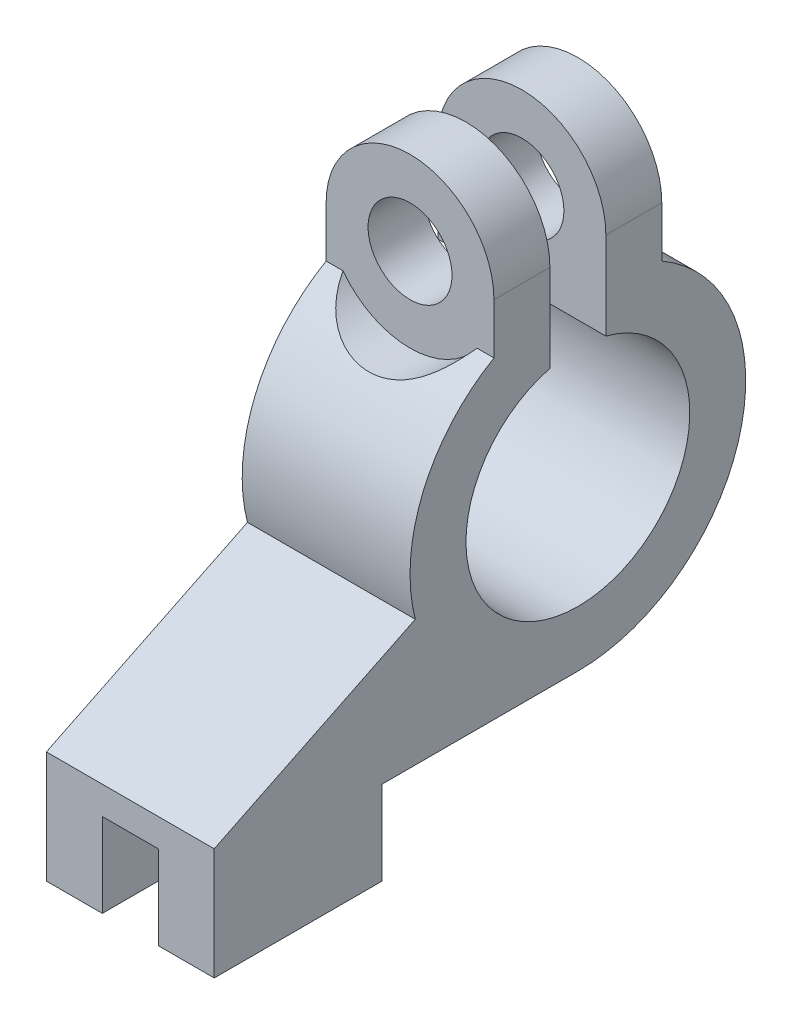
ISO-10303-21;
HEADER;
FILE_DESCRIPTION(('STEP AP214'),'2;1');
FILE_NAME('part.step','',(''),(''),'','','');
FILE_SCHEMA(('AUTOMOTIVE_DESIGN { 1 0 10303 214 1 1 1 1 }'));
ENDSEC;
DATA;
#1=APPLICATION_CONTEXT('core data for automotive mechanical design processes');
#2=APPLICATION_PROTOCOL_DEFINITION('international standard','automotive_design',2000,#1);
#3=PRODUCT_CONTEXT('',#1,'mechanical');
#4=PRODUCT('Part','Part','',(#3));
#5=PRODUCT_RELATED_PRODUCT_CATEGORY('part','',(#4));
#6=PRODUCT_DEFINITION_FORMATION('','',#4);
#7=PRODUCT_DEFINITION_CONTEXT('part definition',#1,'design');
#8=PRODUCT_DEFINITION('design','',#6,#7);
#9=PRODUCT_DEFINITION_SHAPE('','',#8);
#10=(LENGTH_UNIT() NAMED_UNIT(*) SI_UNIT(.MILLI.,.METRE.));
#11=(NAMED_UNIT(*) PLANE_ANGLE_UNIT() SI_UNIT($,.RADIAN.));
#12=(NAMED_UNIT(*) SI_UNIT($,.STERADIAN.) SOLID_ANGLE_UNIT());
#13=UNCERTAINTY_MEASURE_WITH_UNIT(LENGTH_MEASURE(1.E-05),#10,'distance_accuracy_value','');
#14=(GEOMETRIC_REPRESENTATION_CONTEXT(3) GLOBAL_UNCERTAINTY_ASSIGNED_CONTEXT((#13)) GLOBAL_UNIT_ASSIGNED_CONTEXT((#10,
#11,#12)) REPRESENTATION_CONTEXT('',''));
#15=CARTESIAN_POINT('',(0.,0.,0.));
#16=DIRECTION('',(0.,0.,1.));
#17=DIRECTION('',(1.,0.,0.));
#18=AXIS2_PLACEMENT_3D('',#15,#16,#17);
#19=CARTESIAN_POINT('',(30.,-45.,0.));
#20=DIRECTION('',(0.,1.,0.));
#21=DIRECTION('',(0.,0.,1.));
#22=AXIS2_PLACEMENT_3D('',#19,#20,#21);
#23=PLANE('',#22);
#24=DIRECTION('',(0.,0.,-1.));
#25=VECTOR('',#24,1.);
#26=CARTESIAN_POINT('',(10.,-45.,0.));
#27=LINE('',#26,#25);
#28=CARTESIAN_POINT('',(10.,-45.,65.));
#29=VERTEX_POINT('',#28);
#30=CARTESIAN_POINT('',(10.,-45.,35.));
#31=VERTEX_POINT('',#30);
#32=EDGE_CURVE('E72',#29,#31,#27,.T.);
#33=ORIENTED_EDGE('',*,*,#32,.F.);
#34=DIRECTION('',(-1.,0.,0.));
#35=VECTOR('',#34,1.);
#36=CARTESIAN_POINT('',(30.,-45.,65.));
#37=LINE('',#36,#35);
#38=CARTESIAN_POINT('',(0.,-45.,65.));
#39=VERTEX_POINT('',#38);
#40=EDGE_CURVE('E217',#29,#39,#37,.T.);
#41=ORIENTED_EDGE('',*,*,#40,.T.);
#42=DIRECTION('',(0.,0.,-1.));
#43=VECTOR('',#42,1.);
#44=CARTESIAN_POINT('',(0.,-45.,0.));
#45=LINE('',#44,#43);
#46=CARTESIAN_POINT('',(0.,-45.,35.));
#47=VERTEX_POINT('',#46);
#48=EDGE_CURVE('E322',#39,#47,#45,.T.);
#49=ORIENTED_EDGE('',*,*,#48,.T.);
#50=DIRECTION('',(-1.,0.,0.));
#51=VECTOR('',#50,1.);
#52=CARTESIAN_POINT('',(30.,-45.,35.));
#53=LINE('',#52,#51);
#54=EDGE_CURVE('E218',#31,#47,#53,.T.);
#55=ORIENTED_EDGE('',*,*,#54,.F.);
#56=EDGE_LOOP('',(#33,#41,#49,#55));
#57=FACE_BOUND('',#56,.T.);
#58=ADVANCED_FACE('F53',(#57),#23,.F.);
#59=CARTESIAN_POINT('',(30.,0.,35.));
#60=DIRECTION('',(0.,0.,1.));
#61=DIRECTION('',(1.,0.,0.));
#62=AXIS2_PLACEMENT_3D('',#59,#60,#61);
#63=PLANE('',#62);
#64=DIRECTION('',(0.,1.,0.));
#65=VECTOR('',#64,1.);
#66=CARTESIAN_POINT('',(10.,0.,35.));
#67=LINE('',#66,#65);
#68=CARTESIAN_POINT('',(10.,-30.,35.));
#69=VERTEX_POINT('',#68);
#70=EDGE_CURVE('E313',#31,#69,#67,.T.);
#71=ORIENTED_EDGE('',*,*,#70,.F.);
#72=ORIENTED_EDGE('',*,*,#54,.T.);
#73=DIRECTION('',(0.,1.,0.));
#74=VECTOR('',#73,1.);
#75=CARTESIAN_POINT('',(0.,0.,35.));
#76=LINE('',#75,#74);
#77=CARTESIAN_POINT('',(0.,-30.,35.));
#78=VERTEX_POINT('',#77);
#79=EDGE_CURVE('E325',#47,#78,#76,.T.);
#80=ORIENTED_EDGE('',*,*,#79,.T.);
#81=DIRECTION('',(-1.,0.,0.));
#82=VECTOR('',#81,1.);
#83=CARTESIAN_POINT('',(30.,-30.,35.));
#84=LINE('',#83,#82);
#85=EDGE_CURVE('E368',#69,#78,#84,.T.);
#86=ORIENTED_EDGE('',*,*,#85,.F.);
#87=EDGE_LOOP('',(#71,#72,#80,#86));
#88=FACE_BOUND('',#87,.T.);
#89=ADVANCED_FACE('F286',(#88),#63,.F.);
#90=CARTESIAN_POINT('',(30.,0.,0.));
#91=DIRECTION('',(-1.,0.,0.));
#92=DIRECTION('',(0.,0.,1.));
#93=AXIS2_PLACEMENT_3D('',#90,#91,#92);
#94=CYLINDRICAL_SURFACE('',#93,30.);
#95=CARTESIAN_POINT('',(3.01445253868973,25.9807621135332,15.));
#96=CARTESIAN_POINT('',(3.08971257503611,25.8807547670215,15.1732226364169));
#97=CARTESIAN_POINT('',(3.16782453931834,25.7795535388635,15.3445013375211));
#98=CARTESIAN_POINT('',(3.33005232698813,25.5750661159309,15.6829548925338));
#99=CARTESIAN_POINT('',(3.41416894225289,25.4717796474533,15.8501292012448));
#100=CARTESIAN_POINT('',(3.67614111428807,25.1590527444516,16.3454743989584));
#101=CARTESIAN_POINT('',(3.86345112948308,24.9469710486375,16.6670770668505));
#102=CARTESIAN_POINT('',(4.26626830385223,24.517916812582,17.292087734535));
#103=CARTESIAN_POINT('',(4.48192818952391,24.3009234674978,17.595383176681));
#104=CARTESIAN_POINT('',(4.94208136013862,23.8672507478766,18.1792865334444));
#105=CARTESIAN_POINT('',(5.18655853005551,23.65057126581,18.459906981627));
#106=CARTESIAN_POINT('',(5.66362743392203,23.2564095543692,18.9531675133448));
#107=CARTESIAN_POINT('',(5.89183030327061,23.0782172837144,19.1694900291297));
#108=CARTESIAN_POINT('',(6.36928801421941,22.7281456053987,19.5832791476924));
#109=CARTESIAN_POINT('',(6.61854308328254,22.556266265976,19.7807455466861));
#110=CARTESIAN_POINT('',(7.13697667140093,22.2223764688641,20.1551174725314));
#111=CARTESIAN_POINT('',(7.40610105682739,22.0603412402938,20.3320757186267));
#112=CARTESIAN_POINT('',(7.96388457149451,21.7487695138526,20.6650194826522));
#113=CARTESIAN_POINT('',(8.25254342282049,21.599232838234,20.8210052988606));
#114=CARTESIAN_POINT('',(8.84979349892589,21.3147875546876,21.1121183121129));
#115=CARTESIAN_POINT('',(9.15849946444014,21.1799776713007,21.2471070344364));
#116=CARTESIAN_POINT('',(9.79215978238597,20.9289472522521,21.4944236096393));
#117=CARTESIAN_POINT('',(10.1171146428044,20.8127272982423,21.6067507534995));
#118=CARTESIAN_POINT('',(10.7809878383971,20.6013415186415,21.8083952680617));
#119=CARTESIAN_POINT('',(11.1199149998221,20.5061892508699,21.8976978276535));
#120=CARTESIAN_POINT('',(11.8086639327969,20.3391369541052,22.0529486662081));
#121=CARTESIAN_POINT('',(12.1584846534091,20.2672346896796,22.1188991904715));
#122=CARTESIAN_POINT('',(12.8308417334297,20.1541513989451,22.2219579872299));
#123=CARTESIAN_POINT('',(13.1526503348693,20.1106335597506,22.2612753806805));
#124=CARTESIAN_POINT('',(13.8001496753213,20.0445248051273,22.3208203158092));
#125=CARTESIAN_POINT('',(14.1258401310602,20.0219323720493,22.3410492419117));
#126=CARTESIAN_POINT('',(14.7784653192773,19.9980834139667,22.3623995790454));
#127=CARTESIAN_POINT('',(15.1053993750215,19.996816592158,22.3635302114495));
#128=CARTESIAN_POINT('',(15.7581618927426,20.0156149512808,22.3467071172679));
#129=CARTESIAN_POINT('',(16.0839903635039,20.0356799623199,22.328753542674));
#130=CARTESIAN_POINT('',(16.7204105781226,20.0956831312075,22.2747631312453));
#131=CARTESIAN_POINT('',(17.0311295582828,20.1348824244758,22.2393982210993));
#132=CARTESIAN_POINT('',(17.6470410553454,20.2321170573487,22.1509763305753));
#133=CARTESIAN_POINT('',(17.9522337667894,20.2901517325233,22.0979199742723));
#134=CARTESIAN_POINT('',(18.5550191849141,20.4240896291477,21.9741862874433));
#135=CARTESIAN_POINT('',(18.8526120048402,20.499992584171,21.9035092196514));
#136=CARTESIAN_POINT('',(19.4382726601973,20.6684061513958,21.7446630852028));
#137=CARTESIAN_POINT('',(19.7263403349304,20.760917043619,21.6564937236107));
#138=CARTESIAN_POINT('',(20.295155898617,20.9624206557098,21.4615198509829));
#139=CARTESIAN_POINT('',(20.5757448446171,21.0716259932624,21.3544717241238));
#140=CARTESIAN_POINT('',(21.1237468076387,21.3037130119085,21.1229416175942));
#141=CARTESIAN_POINT('',(21.3911597902022,21.4265947287661,20.9984595923335));
#142=CARTESIAN_POINT('',(21.9114639103858,21.6839983852229,20.7325452046875));
#143=CARTESIAN_POINT('',(22.1643580263126,21.8185179232188,20.5911163371767));
#144=CARTESIAN_POINT('',(22.6547088909968,22.097094874822,20.2918746563285));
#145=CARTESIAN_POINT('',(22.892165244521,22.241152532431,20.1340614237916));
#146=CARTESIAN_POINT('',(23.3669139930002,22.5468919573389,19.7912601701808));
#147=CARTESIAN_POINT('',(23.6030521053302,22.7091030594606,19.6051464269669));
#148=CARTESIAN_POINT('',(24.0565563729563,23.0393355804947,19.2159865035483));
#149=CARTESIAN_POINT('',(24.2739210567547,23.2073574534237,19.01293899849));
#150=CARTESIAN_POINT('',(24.6901474035738,23.5469094417106,18.5907646384501));
#151=CARTESIAN_POINT('',(24.8889850057555,23.7184437756978,18.3716175175593));
#152=CARTESIAN_POINT('',(25.2681969172962,24.0624649530106,17.9186671474033));
#153=CARTESIAN_POINT('',(25.4485730293575,24.2349517015994,17.6848653327214));
#154=CARTESIAN_POINT('',(25.7548272549145,24.5419827655767,17.2552926786907));
#155=CARTESIAN_POINT('',(25.8841083002779,24.6767489251937,17.0620880356106));
#156=CARTESIAN_POINT('',(26.1320973424406,24.9446669949728,16.6679443106239));
#157=CARTESIAN_POINT('',(26.2508057639085,25.0778189697857,16.4670055398372));
#158=CARTESIAN_POINT('',(26.4776556886953,25.3411432547947,16.0588034359427));
#159=CARTESIAN_POINT('',(26.5858386399376,25.4713255667404,15.8515695102964));
#160=CARTESIAN_POINT('',(26.7926916753654,25.728559531358,15.4305622247241));
#161=CARTESIAN_POINT('',(26.8913632207323,25.8556116626616,15.2167898759258));
#162=CARTESIAN_POINT('',(26.9855474613103,25.9807621135332,15.));
#163=B_SPLINE_CURVE_WITH_KNOTS('',3,(#95,#96,#97,#98,#99,#100,#101,#102,#103,#104,#105,#106,
#107,#108,#109,#110,#111,#112,#113,#114,#115,#116,#117,#118,#119,#120,#121,#122,#123,#124,#125,
#126,#127,#128,#129,#130,#131,#132,#133,#134,#135,#136,#137,#138,#139,#140,#141,#142,#143,#144,
#145,#146,#147,#148,#149,#150,#151,#152,#153,#154,#155,#156,#157,#158,#159,#160,#161,#162),
.UNSPECIFIED.,.F.,.F.,(4,2,2,2,2,2,2,2,2,2,2,2,2,2,2,2,2,2,2,2,2,2,2,2,2,2,2,2,2,2,2,2,2,4),(0.,
0.641065834236214,1.28221636725091,2.5659585647395,3.85692398541223,5.14717087498479,
6.23035863765068,7.3135581053437,8.39390820328841,9.47424293444297,10.5614251489932,
11.6486413732381,12.7365552399378,13.8243644751847,14.8044723864152,15.7845092081503,
16.7640728178064,17.7436286260132,18.6880386662347,19.6324153954111,20.5767780442722,
21.5211566172647,22.4787567780406,23.4363594430163,24.3937649644797,25.3511949875249,
26.3750483533381,27.398981898065,28.4242271974174,29.4493722893141,30.2551753842046,
31.0609460979369,31.8634031512578,32.6657367306905),.UNSPECIFIED.);
#164=CARTESIAN_POINT('',(3.01445253868973,25.9807621135332,15.));
#165=VERTEX_POINT('',#164);
#166=CARTESIAN_POINT('',(26.9855474613103,25.9807621135332,15.));
#167=VERTEX_POINT('',#166);
#168=EDGE_CURVE('E65',#165,#167,#163,.T.);
#169=ORIENTED_EDGE('',*,*,#168,.F.);
#170=DIRECTION('',(-1.,0.,0.));
#171=VECTOR('',#170,1.);
#172=CARTESIAN_POINT('',(30.,25.9807621135332,15.));
#173=LINE('',#172,#171);
#174=CARTESIAN_POINT('',(0.,25.9807621135332,15.));
#175=VERTEX_POINT('',#174);
#176=EDGE_CURVE('E229',#165,#175,#173,.T.);
#177=ORIENTED_EDGE('',*,*,#176,.T.);
#178=CARTESIAN_POINT('',(0.,0.,0.));
#179=DIRECTION('',(1.,0.,0.));
#180=DIRECTION('',(0.,0.,-1.));
#181=AXIS2_PLACEMENT_3D('',#178,#179,#180);
#182=CIRCLE('',#181,30.);
#183=CARTESIAN_POINT('',(0.,-7.43900942873639,29.0630545318136));
#184=VERTEX_POINT('',#183);
#185=EDGE_CURVE('E327',#175,#184,#182,.T.);
#186=ORIENTED_EDGE('',*,*,#185,.T.);
#187=DIRECTION('',(-1.,0.,0.));
#188=VECTOR('',#187,1.);
#189=CARTESIAN_POINT('',(30.,-7.43900942873639,29.0630545318136));
#190=LINE('',#189,#188);
#191=CARTESIAN_POINT('',(30.,-7.43900942873639,29.0630545318136));
#192=VERTEX_POINT('',#191);
#193=EDGE_CURVE('E227',#192,#184,#190,.T.);
#194=ORIENTED_EDGE('',*,*,#193,.F.);
#195=CARTESIAN_POINT('',(30.,0.,0.));
#196=DIRECTION('',(1.,0.,0.));
#197=DIRECTION('',(0.,0.,-1.));
#198=AXIS2_PLACEMENT_3D('',#195,#196,#197);
#199=CIRCLE('',#198,30.);
#200=CARTESIAN_POINT('',(30.,25.9807621135332,15.));
#201=VERTEX_POINT('',#200);
#202=EDGE_CURVE('E358',#201,#192,#199,.T.);
#203=ORIENTED_EDGE('',*,*,#202,.F.);
#204=EDGE_CURVE('E230',#201,#167,#173,.T.);
#205=ORIENTED_EDGE('',*,*,#204,.T.);
#206=EDGE_LOOP('',(#169,#177,#186,#194,#203,#205));
#207=FACE_BOUND('',#206,.T.);
#208=ADVANCED_FACE('F253',(#207),#94,.T.);
#209=CARTESIAN_POINT('',(30.,0.,-15.));
#210=DIRECTION('',(0.,0.,1.));
#211=DIRECTION('',(1.,0.,0.));
#212=AXIS2_PLACEMENT_3D('',#209,#210,#211);
#213=PLANE('',#212);
#214=DIRECTION('',(-1.,0.,0.));
#215=VECTOR('',#214,1.);
#216=CARTESIAN_POINT('',(30.,25.9807621135332,-15.));
#217=LINE('',#216,#215);
#218=CARTESIAN_POINT('',(30.,25.9807621135332,-15.));
#219=VERTEX_POINT('',#218);
#220=CARTESIAN_POINT('',(26.9855474613103,25.9807621135332,-15.));
#221=VERTEX_POINT('',#220);
#222=EDGE_CURVE('E239',#219,#221,#217,.T.);
#223=ORIENTED_EDGE('',*,*,#222,.T.);
#224=CARTESIAN_POINT('',(15.,35.,-15.));
#225=DIRECTION('',(0.,0.,1.));
#226=DIRECTION('',(1.,0.,0.));
#227=AXIS2_PLACEMENT_3D('',#224,#225,#226);
#228=CIRCLE('',#227,15.);
#229=CARTESIAN_POINT('',(3.01445253868973,25.9807621135332,-15.));
#230=VERTEX_POINT('',#229);
#231=EDGE_CURVE('E80',#230,#221,#228,.T.);
#232=ORIENTED_EDGE('',*,*,#231,.F.);
#233=CARTESIAN_POINT('',(0.,25.9807621135332,-15.));
#234=VERTEX_POINT('',#233);
#235=EDGE_CURVE('E238',#230,#234,#217,.T.);
#236=ORIENTED_EDGE('',*,*,#235,.T.);
#237=DIRECTION('',(0.,1.,0.));
#238=VECTOR('',#237,1.);
#239=CARTESIAN_POINT('',(0.,0.,-15.));
#240=LINE('',#239,#238);
#241=CARTESIAN_POINT('',(0.,35.,-15.));
#242=VERTEX_POINT('',#241);
#243=EDGE_CURVE('E374',#234,#242,#240,.T.);
#244=ORIENTED_EDGE('',*,*,#243,.T.);
#245=CARTESIAN_POINT('',(15.,35.,-15.));
#246=DIRECTION('',(0.,0.,1.));
#247=DIRECTION('',(1.,0.,0.));
#248=AXIS2_PLACEMENT_3D('',#245,#246,#247);
#249=CIRCLE('',#248,15.);
#250=CARTESIAN_POINT('',(30.,35.,-15.));
#251=VERTEX_POINT('',#250);
#252=EDGE_CURVE('E429',#251,#242,#249,.T.);
#253=ORIENTED_EDGE('',*,*,#252,.F.);
#254=DIRECTION('',(0.,1.,0.));
#255=VECTOR('',#254,1.);
#256=CARTESIAN_POINT('',(30.,0.,-15.));
#257=LINE('',#256,#255);
#258=EDGE_CURVE('E340',#219,#251,#257,.T.);
#259=ORIENTED_EDGE('',*,*,#258,.F.);
#260=EDGE_LOOP('',(#223,#232,#236,#244,#253,#259));
#261=FACE_BOUND('',#260,.T.);
#262=CARTESIAN_POINT('',(15.,35.,-15.));
#263=DIRECTION('',(0.,0.,1.));
#264=DIRECTION('',(1.,0.,0.));
#265=AXIS2_PLACEMENT_3D('',#262,#263,#264);
#266=CIRCLE('',#265,7.5);
#267=CARTESIAN_POINT('',(22.5,35.,-15.));
#268=VERTEX_POINT('',#267);
#269=EDGE_CURVE('E414',#268,#268,#266,.T.);
#270=ORIENTED_EDGE('',*,*,#269,.T.);
#271=EDGE_LOOP('',(#270));
#272=FACE_BOUND('',#271,.T.);
#273=ADVANCED_FACE('F457',(#261,#272),#213,.F.);
#274=CARTESIAN_POINT('',(30.,0.,-5.));
#275=DIRECTION('',(0.,0.,-1.));
#276=DIRECTION('',(-1.,0.,0.));
#277=AXIS2_PLACEMENT_3D('',#274,#275,#276);
#278=PLANE('',#277);
#279=CARTESIAN_POINT('',(15.,35.,-5.));
#280=DIRECTION('',(0.,0.,-1.));
#281=DIRECTION('',(-1.,0.,0.));
#282=AXIS2_PLACEMENT_3D('',#279,#280,#281);
#283=CIRCLE('',#282,7.5);
#284=CARTESIAN_POINT('',(7.5,35.,-5.));
#285=VERTEX_POINT('',#284);
#286=EDGE_CURVE('E422',#285,#285,#283,.T.);
#287=ORIENTED_EDGE('',*,*,#286,.T.);
#288=EDGE_LOOP('',(#287));
#289=FACE_BOUND('',#288,.T.);
#290=DIRECTION('',(0.,-1.,0.));
#291=VECTOR('',#290,1.);
#292=CARTESIAN_POINT('',(30.,0.,-5.));
#293=LINE('',#292,#291);
#294=CARTESIAN_POINT('',(30.,35.,-5.));
#295=VERTEX_POINT('',#294);
#296=CARTESIAN_POINT('',(30.,19.3649167310371,-5.));
#297=VERTEX_POINT('',#296);
#298=EDGE_CURVE('E348',#295,#297,#293,.T.);
#299=ORIENTED_EDGE('',*,*,#298,.F.);
#300=CARTESIAN_POINT('',(15.,35.,-5.));
#301=DIRECTION('',(0.,0.,-1.));
#302=DIRECTION('',(-1.,0.,0.));
#303=AXIS2_PLACEMENT_3D('',#300,#301,#302);
#304=CIRCLE('',#303,15.);
#305=CARTESIAN_POINT('',(0.,35.,-5.));
#306=VERTEX_POINT('',#305);
#307=EDGE_CURVE('E343',#306,#295,#304,.T.);
#308=ORIENTED_EDGE('',*,*,#307,.F.);
#309=DIRECTION('',(0.,-1.,0.));
#310=VECTOR('',#309,1.);
#311=CARTESIAN_POINT('',(0.,0.,-5.));
#312=LINE('',#311,#310);
#313=CARTESIAN_POINT('',(0.,19.3649167310371,-5.));
#314=VERTEX_POINT('',#313);
#315=EDGE_CURVE('E377',#306,#314,#312,.T.);
#316=ORIENTED_EDGE('',*,*,#315,.T.);
#317=DIRECTION('',(-1.,0.,0.));
#318=VECTOR('',#317,1.);
#319=CARTESIAN_POINT('',(30.,19.3649167310371,-5.));
#320=LINE('',#319,#318);
#321=EDGE_CURVE('E235',#297,#314,#320,.T.);
#322=ORIENTED_EDGE('',*,*,#321,.F.);
#323=EDGE_LOOP('',(#299,#308,#316,#322));
#324=FACE_BOUND('',#323,.T.);
#325=ADVANCED_FACE('F446',(#289,#324),#278,.F.);
#326=CARTESIAN_POINT('',(30.,0.,5.));
#327=DIRECTION('',(0.,0.,1.));
#328=DIRECTION('',(1.,0.,0.));
#329=AXIS2_PLACEMENT_3D('',#326,#327,#328);
#330=PLANE('',#329);
#331=CARTESIAN_POINT('',(15.,35.,5.));
#332=DIRECTION('',(0.,0.,1.));
#333=DIRECTION('',(1.,0.,0.));
#334=AXIS2_PLACEMENT_3D('',#331,#332,#333);
#335=CIRCLE('',#334,7.5);
#336=CARTESIAN_POINT('',(22.5,35.,5.));
#337=VERTEX_POINT('',#336);
#338=EDGE_CURVE('E417',#337,#337,#335,.T.);
#339=ORIENTED_EDGE('',*,*,#338,.T.);
#340=EDGE_LOOP('',(#339));
#341=FACE_BOUND('',#340,.T.);
#342=CARTESIAN_POINT('',(15.,35.,5.));
#343=DIRECTION('',(0.,0.,1.));
#344=DIRECTION('',(1.,0.,0.));
#345=AXIS2_PLACEMENT_3D('',#342,#343,#344);
#346=CIRCLE('',#345,15.);
#347=CARTESIAN_POINT('',(30.,35.,5.));
#348=VERTEX_POINT('',#347);
#349=CARTESIAN_POINT('',(0.,35.,5.));
#350=VERTEX_POINT('',#349);
#351=EDGE_CURVE('E434',#348,#350,#346,.T.);
#352=ORIENTED_EDGE('',*,*,#351,.F.);
#353=DIRECTION('',(0.,1.,0.));
#354=VECTOR('',#353,1.);
#355=CARTESIAN_POINT('',(30.,0.,5.));
#356=LINE('',#355,#354);
#357=CARTESIAN_POINT('',(30.,19.3649167310371,5.));
#358=VERTEX_POINT('',#357);
#359=EDGE_CURVE('E353',#358,#348,#356,.T.);
#360=ORIENTED_EDGE('',*,*,#359,.F.);
#361=DIRECTION('',(-1.,0.,0.));
#362=VECTOR('',#361,1.);
#363=CARTESIAN_POINT('',(30.,19.3649167310371,5.));
#364=LINE('',#363,#362);
#365=CARTESIAN_POINT('',(0.,19.3649167310371,5.));
#366=VERTEX_POINT('',#365);
#367=EDGE_CURVE('E233',#358,#366,#364,.T.);
#368=ORIENTED_EDGE('',*,*,#367,.T.);
#369=DIRECTION('',(0.,1.,0.));
#370=VECTOR('',#369,1.);
#371=CARTESIAN_POINT('',(0.,0.,5.));
#372=LINE('',#371,#370);
#373=EDGE_CURVE('E382',#366,#350,#372,.T.);
#374=ORIENTED_EDGE('',*,*,#373,.T.);
#375=EDGE_LOOP('',(#352,#360,#368,#374));
#376=FACE_BOUND('',#375,.T.);
#377=ADVANCED_FACE('F451',(#341,#376),#330,.F.);
#378=CARTESIAN_POINT('',(30.,0.,15.));
#379=DIRECTION('',(0.,0.,-1.));
#380=DIRECTION('',(-1.,0.,0.));
#381=AXIS2_PLACEMENT_3D('',#378,#379,#380);
#382=PLANE('',#381);
#383=CARTESIAN_POINT('',(15.,35.,15.));
#384=DIRECTION('',(0.,0.,1.));
#385=DIRECTION('',(1.,0.,0.));
#386=AXIS2_PLACEMENT_3D('',#383,#384,#385);
#387=CIRCLE('',#386,7.5);
#388=CARTESIAN_POINT('',(22.5,35.,15.));
#389=VERTEX_POINT('',#388);
#390=EDGE_CURVE('E413',#389,#389,#387,.T.);
#391=ORIENTED_EDGE('',*,*,#390,.F.);
#392=EDGE_LOOP('',(#391));
#393=FACE_BOUND('',#392,.T.);
#394=CARTESIAN_POINT('',(15.,35.,15.));
#395=DIRECTION('',(0.,0.,1.));
#396=DIRECTION('',(1.,0.,0.));
#397=AXIS2_PLACEMENT_3D('',#394,#395,#396);
#398=CIRCLE('',#397,15.);
#399=CARTESIAN_POINT('',(30.,35.,15.));
#400=VERTEX_POINT('',#399);
#401=CARTESIAN_POINT('',(0.,35.,15.));
#402=VERTEX_POINT('',#401);
#403=EDGE_CURVE('E428',#400,#402,#398,.T.);
#404=ORIENTED_EDGE('',*,*,#403,.T.);
#405=DIRECTION('',(0.,-1.,0.));
#406=VECTOR('',#405,1.);
#407=CARTESIAN_POINT('',(0.,0.,15.));
#408=LINE('',#407,#406);
#409=EDGE_CURVE('E385',#402,#175,#408,.T.);
#410=ORIENTED_EDGE('',*,*,#409,.T.);
#411=ORIENTED_EDGE('',*,*,#176,.F.);
#412=CARTESIAN_POINT('',(15.,35.,15.));
#413=DIRECTION('',(0.,0.,1.));
#414=DIRECTION('',(1.,0.,0.));
#415=AXIS2_PLACEMENT_3D('',#412,#413,#414);
#416=CIRCLE('',#415,15.);
#417=EDGE_CURVE('E411',#165,#167,#416,.T.);
#418=ORIENTED_EDGE('',*,*,#417,.T.);
#419=ORIENTED_EDGE('',*,*,#204,.F.);
#420=DIRECTION('',(0.,-1.,0.));
#421=VECTOR('',#420,1.);
#422=CARTESIAN_POINT('',(30.,0.,15.));
#423=LINE('',#422,#421);
#424=EDGE_CURVE('E356',#400,#201,#423,.T.);
#425=ORIENTED_EDGE('',*,*,#424,.F.);
#426=EDGE_LOOP('',(#404,#410,#411,#418,#419,#425));
#427=FACE_BOUND('',#426,.T.);
#428=ADVANCED_FACE('F279',(#393,#427),#382,.F.);
#429=CARTESIAN_POINT('',(30.,0.,0.));
#430=DIRECTION('',(1.,0.,0.));
#431=DIRECTION('',(0.,0.,-1.));
#432=AXIS2_PLACEMENT_3D('',#429,#430,#431);
#433=PLANE('',#432);
#434=ORIENTED_EDGE('',*,*,#258,.T.);
#435=DIRECTION('',(0.,0.,1.));
#436=VECTOR('',#435,1.);
#437=CARTESIAN_POINT('',(30.,35.,-15.));
#438=LINE('',#437,#436);
#439=EDGE_CURVE('E425',#251,#295,#438,.T.);
#440=ORIENTED_EDGE('',*,*,#439,.T.);
#441=ORIENTED_EDGE('',*,*,#298,.T.);
#442=CARTESIAN_POINT('',(30.,0.,0.));
#443=DIRECTION('',(1.,0.,0.));
#444=DIRECTION('',(0.,0.,-1.));
#445=AXIS2_PLACEMENT_3D('',#442,#443,#444);
#446=CIRCLE('',#445,20.);
#447=EDGE_CURVE('E350',#358,#297,#446,.T.);
#448=ORIENTED_EDGE('',*,*,#447,.F.);
#449=ORIENTED_EDGE('',*,*,#359,.T.);
#450=DIRECTION('',(0.,0.,1.));
#451=VECTOR('',#450,1.);
#452=CARTESIAN_POINT('',(30.,35.,-15.));
#453=LINE('',#452,#451);
#454=EDGE_CURVE('E245',#348,#400,#453,.T.);
#455=ORIENTED_EDGE('',*,*,#454,.T.);
#456=ORIENTED_EDGE('',*,*,#424,.T.);
#457=ORIENTED_EDGE('',*,*,#202,.T.);
#458=DIRECTION('',(0.,0.439045010289997,-0.89846506829117));
#459=VECTOR('',#458,1.);
#460=CARTESIAN_POINT('',(30.,5.45934236146505,2.66776874010784));
#461=LINE('',#460,#459);
#462=CARTESIAN_POINT('',(30.,-25.,65.));
#463=VERTEX_POINT('',#462);
#464=EDGE_CURVE('E360',#463,#192,#461,.T.);
#465=ORIENTED_EDGE('',*,*,#464,.F.);
#466=DIRECTION('',(0.,1.,0.));
#467=VECTOR('',#466,1.);
#468=CARTESIAN_POINT('',(30.,0.,65.));
#469=LINE('',#468,#467);
#470=CARTESIAN_POINT('',(30.,-45.,65.));
#471=VERTEX_POINT('',#470);
#472=EDGE_CURVE('E363',#471,#463,#469,.T.);
#473=ORIENTED_EDGE('',*,*,#472,.F.);
#474=DIRECTION('',(0.,0.,-1.));
#475=VECTOR('',#474,1.);
#476=CARTESIAN_POINT('',(30.,-45.,0.));
#477=LINE('',#476,#475);
#478=CARTESIAN_POINT('',(30.,-45.,35.));
#479=VERTEX_POINT('',#478);
#480=EDGE_CURVE('E365',#471,#479,#477,.T.);
#481=ORIENTED_EDGE('',*,*,#480,.T.);
#482=DIRECTION('',(0.,1.,0.));
#483=VECTOR('',#482,1.);
#484=CARTESIAN_POINT('',(30.,0.,35.));
#485=LINE('',#484,#483);
#486=CARTESIAN_POINT('',(30.,-30.,35.));
#487=VERTEX_POINT('',#486);
#488=EDGE_CURVE('E216',#479,#487,#485,.T.);
#489=ORIENTED_EDGE('',*,*,#488,.T.);
#490=DIRECTION('',(0.,0.,1.));
#491=VECTOR('',#490,1.);
#492=CARTESIAN_POINT('',(30.,-30.,0.));
#493=LINE('',#492,#491);
#494=CARTESIAN_POINT('',(30.,-30.,0.));
#495=VERTEX_POINT('',#494);
#496=EDGE_CURVE('E331',#495,#487,#493,.T.);
#497=ORIENTED_EDGE('',*,*,#496,.F.);
#498=CARTESIAN_POINT('',(30.,0.,0.));
#499=DIRECTION('',(1.,0.,0.));
#500=DIRECTION('',(0.,0.,-1.));
#501=AXIS2_PLACEMENT_3D('',#498,#499,#500);
#502=CIRCLE('',#501,30.);
#503=EDGE_CURVE('E336',#495,#219,#502,.T.);
#504=ORIENTED_EDGE('',*,*,#503,.T.);
#505=EDGE_LOOP('',(#434,#440,#441,#448,#449,#455,#456,#457,#465,#473,#481,#489,#497,#504));
#506=FACE_BOUND('',#505,.T.);
#507=ADVANCED_FACE('F275',(#506),#433,.T.);
#508=CARTESIAN_POINT('',(0.,0.,0.));
#509=DIRECTION('',(1.,0.,0.));
#510=DIRECTION('',(0.,0.,-1.));
#511=AXIS2_PLACEMENT_3D('',#508,#509,#510);
#512=PLANE('',#511);
#513=DIRECTION('',(0.,0.,1.));
#514=VECTOR('',#513,1.);
#515=CARTESIAN_POINT('',(0.,35.,-15.));
#516=LINE('',#515,#514);
#517=EDGE_CURVE('E431',#242,#306,#516,.T.);
#518=ORIENTED_EDGE('',*,*,#517,.F.);
#519=ORIENTED_EDGE('',*,*,#243,.F.);
#520=CARTESIAN_POINT('',(0.,0.,0.));
#521=DIRECTION('',(1.,0.,0.));
#522=DIRECTION('',(0.,0.,-1.));
#523=AXIS2_PLACEMENT_3D('',#520,#521,#522);
#524=CIRCLE('',#523,30.);
#525=CARTESIAN_POINT('',(0.,-30.,0.));
#526=VERTEX_POINT('',#525);
#527=EDGE_CURVE('E371',#526,#234,#524,.T.);
#528=ORIENTED_EDGE('',*,*,#527,.F.);
#529=DIRECTION('',(0.,0.,1.));
#530=VECTOR('',#529,1.);
#531=CARTESIAN_POINT('',(0.,-30.,0.));
#532=LINE('',#531,#530);
#533=EDGE_CURVE('E369',#526,#78,#532,.T.);
#534=ORIENTED_EDGE('',*,*,#533,.T.);
#535=ORIENTED_EDGE('',*,*,#79,.F.);
#536=ORIENTED_EDGE('',*,*,#48,.F.);
#537=DIRECTION('',(0.,1.,0.));
#538=VECTOR('',#537,1.);
#539=CARTESIAN_POINT('',(0.,0.,65.));
#540=LINE('',#539,#538);
#541=CARTESIAN_POINT('',(0.,-25.,65.));
#542=VERTEX_POINT('',#541);
#543=EDGE_CURVE('E319',#39,#542,#540,.T.);
#544=ORIENTED_EDGE('',*,*,#543,.T.);
#545=DIRECTION('',(0.,0.439045010289997,-0.89846506829117));
#546=VECTOR('',#545,1.);
#547=CARTESIAN_POINT('',(0.,5.45934236146505,2.66776874010784));
#548=LINE('',#547,#546);
#549=EDGE_CURVE('E323',#542,#184,#548,.T.);
#550=ORIENTED_EDGE('',*,*,#549,.T.);
#551=ORIENTED_EDGE('',*,*,#185,.F.);
#552=ORIENTED_EDGE('',*,*,#409,.F.);
#553=DIRECTION('',(0.,0.,1.));
#554=VECTOR('',#553,1.);
#555=CARTESIAN_POINT('',(0.,35.,-15.));
#556=LINE('',#555,#554);
#557=EDGE_CURVE('E243',#350,#402,#556,.T.);
#558=ORIENTED_EDGE('',*,*,#557,.F.);
#559=ORIENTED_EDGE('',*,*,#373,.F.);
#560=CARTESIAN_POINT('',(0.,0.,0.));
#561=DIRECTION('',(1.,0.,0.));
#562=DIRECTION('',(0.,0.,-1.));
#563=AXIS2_PLACEMENT_3D('',#560,#561,#562);
#564=CIRCLE('',#563,20.);
#565=EDGE_CURVE('E379',#366,#314,#564,.T.);
#566=ORIENTED_EDGE('',*,*,#565,.T.);
#567=ORIENTED_EDGE('',*,*,#315,.F.);
#568=EDGE_LOOP('',(#518,#519,#528,#534,#535,#536,#544,#550,#551,#552,#558,#559,#566,#567));
#569=FACE_BOUND('',#568,.T.);
#570=ADVANCED_FACE('F278',(#569),#512,.F.);
#571=CARTESIAN_POINT('',(30.,-30.,0.));
#572=DIRECTION('',(0.,-1.,0.));
#573=DIRECTION('',(0.,0.,-1.));
#574=AXIS2_PLACEMENT_3D('',#571,#572,#573);
#575=PLANE('',#574);
#576=ORIENTED_EDGE('',*,*,#533,.F.);
#577=DIRECTION('',(-1.,0.,0.));
#578=VECTOR('',#577,1.);
#579=CARTESIAN_POINT('',(30.,-30.,0.));
#580=LINE('',#579,#578);
#581=EDGE_CURVE('E241',#495,#526,#580,.T.);
#582=ORIENTED_EDGE('',*,*,#581,.F.);
#583=ORIENTED_EDGE('',*,*,#496,.T.);
#584=CARTESIAN_POINT('',(20.,-30.,35.));
#585=VERTEX_POINT('',#584);
#586=EDGE_CURVE('E221',#487,#585,#84,.T.);
#587=ORIENTED_EDGE('',*,*,#586,.T.);
#588=DIRECTION('',(0.,0.,1.));
#589=VECTOR('',#588,1.);
#590=CARTESIAN_POINT('',(20.,-30.,0.));
#591=LINE('',#590,#589);
#592=CARTESIAN_POINT('',(20.,-30.,65.));
#593=VERTEX_POINT('',#592);
#594=EDGE_CURVE('E199',#585,#593,#591,.T.);
#595=ORIENTED_EDGE('',*,*,#594,.T.);
#596=DIRECTION('',(-1.,0.,0.));
#597=VECTOR('',#596,1.);
#598=CARTESIAN_POINT('',(20.,-30.,65.));
#599=LINE('',#598,#597);
#600=CARTESIAN_POINT('',(10.,-30.,65.));
#601=VERTEX_POINT('',#600);
#602=EDGE_CURVE('E408',#593,#601,#599,.T.);
#603=ORIENTED_EDGE('',*,*,#602,.T.);
#604=DIRECTION('',(0.,0.,1.));
#605=VECTOR('',#604,1.);
#606=CARTESIAN_POINT('',(10.,-30.,0.));
#607=LINE('',#606,#605);
#608=EDGE_CURVE('E402',#69,#601,#607,.T.);
#609=ORIENTED_EDGE('',*,*,#608,.F.);
#610=ORIENTED_EDGE('',*,*,#85,.T.);
#611=EDGE_LOOP('',(#576,#582,#583,#587,#595,#603,#609,#610));
#612=FACE_BOUND('',#611,.T.);
#613=ADVANCED_FACE('F55',(#612),#575,.T.);
#614=CARTESIAN_POINT('',(30.,0.,0.));
#615=DIRECTION('',(-1.,0.,0.));
#616=DIRECTION('',(0.,0.,1.));
#617=AXIS2_PLACEMENT_3D('',#614,#615,#616);
#618=CYLINDRICAL_SURFACE('',#617,30.);
#619=ORIENTED_EDGE('',*,*,#235,.F.);
#620=CARTESIAN_POINT('',(3.01445253868973,25.9807621135332,-15.));
#621=CARTESIAN_POINT('',(3.08971257503612,25.8807547670215,-15.1732226364169));
#622=CARTESIAN_POINT('',(3.16782453931834,25.7795535388635,-15.3445013375211));
#623=CARTESIAN_POINT('',(3.33005232698813,25.5750661159309,-15.6829548925338));
#624=CARTESIAN_POINT('',(3.41416894225289,25.4717796474533,-15.8501292012448));
#625=CARTESIAN_POINT('',(3.67614111428807,25.1590527444516,-16.3454743989584));
#626=CARTESIAN_POINT('',(3.86345112948308,24.9469710486375,-16.6670770668505));
#627=CARTESIAN_POINT('',(4.26626830385223,24.517916812582,-17.292087734535));
#628=CARTESIAN_POINT('',(4.48192818952392,24.3009234674978,-17.595383176681));
#629=CARTESIAN_POINT('',(4.94208136013862,23.8672507478766,-18.1792865334444));
#630=CARTESIAN_POINT('',(5.18655853005552,23.65057126581,-18.459906981627));
#631=CARTESIAN_POINT('',(5.66362743392204,23.2564095543692,-18.9531675133448));
#632=CARTESIAN_POINT('',(5.89183030327062,23.0782172837144,-19.1694900291298));
#633=CARTESIAN_POINT('',(6.36928801421942,22.7281456053987,-19.5832791476924));
#634=CARTESIAN_POINT('',(6.61854308328255,22.5562662659759,-19.7807455466861));
#635=CARTESIAN_POINT('',(7.13697667140095,22.2223764688641,-20.1551174725314));
#636=CARTESIAN_POINT('',(7.40610105682741,22.0603412402938,-20.3320757186267));
#637=CARTESIAN_POINT('',(7.96388457149452,21.7487695138526,-20.6650194826522));
#638=CARTESIAN_POINT('',(8.2525434228205,21.599232838234,-20.8210052988607));
#639=CARTESIAN_POINT('',(8.84979349892591,21.3147875546876,-21.1121183121129));
#640=CARTESIAN_POINT('',(9.15849946444016,21.1799776713007,-21.2471070344364));
#641=CARTESIAN_POINT('',(9.79215978238598,20.9289472522521,-21.4944236096393));
#642=CARTESIAN_POINT('',(10.1171146428044,20.8127272982423,-21.6067507534995));
#643=CARTESIAN_POINT('',(10.7809878383971,20.6013415186415,-21.8083952680617));
#644=CARTESIAN_POINT('',(11.1199149998221,20.5061892508699,-21.8976978276535));
#645=CARTESIAN_POINT('',(11.8086639327969,20.3391369541052,-22.0529486662082));
#646=CARTESIAN_POINT('',(12.1584846534091,20.2672346896796,-22.1188991904715));
#647=CARTESIAN_POINT('',(12.8308417334297,20.1541513989451,-22.2219579872299));
#648=CARTESIAN_POINT('',(13.1526503348693,20.1106335597506,-22.2612753806805));
#649=CARTESIAN_POINT('',(13.8001496753213,20.0445248051273,-22.3208203158092));
#650=CARTESIAN_POINT('',(14.1258401310602,20.0219323720493,-22.3410492419117));
#651=CARTESIAN_POINT('',(14.7784653192773,19.9980834139667,-22.3623995790454));
#652=CARTESIAN_POINT('',(15.1053993750215,19.996816592158,-22.3635302114495));
#653=CARTESIAN_POINT('',(15.7581618927426,20.0156149512808,-22.3467071172679));
#654=CARTESIAN_POINT('',(16.0839903635039,20.0356799623199,-22.328753542674));
#655=CARTESIAN_POINT('',(16.7204105781226,20.0956831312075,-22.2747631312453));
#656=CARTESIAN_POINT('',(17.0311295582828,20.1348824244758,-22.2393982210993));
#657=CARTESIAN_POINT('',(17.6470410553454,20.2321170573487,-22.1509763305753));
#658=CARTESIAN_POINT('',(17.9522337667894,20.2901517325233,-22.0979199742723));
#659=CARTESIAN_POINT('',(18.5550191849141,20.4240896291477,-21.9741862874433));
#660=CARTESIAN_POINT('',(18.8526120048402,20.499992584171,-21.9035092196514));
#661=CARTESIAN_POINT('',(19.4382726601973,20.6684061513958,-21.7446630852028));
#662=CARTESIAN_POINT('',(19.7263403349304,20.760917043619,-21.6564937236107));
#663=CARTESIAN_POINT('',(20.295155898617,20.9624206557098,-21.4615198509829));
#664=CARTESIAN_POINT('',(20.5757448446171,21.0716259932624,-21.3544717241238));
#665=CARTESIAN_POINT('',(21.1237468076387,21.3037130119085,-21.1229416175942));
#666=CARTESIAN_POINT('',(21.3911597902022,21.4265947287661,-20.9984595923335));
#667=CARTESIAN_POINT('',(21.9114639103859,21.6839983852229,-20.7325452046875));
#668=CARTESIAN_POINT('',(22.1643580263126,21.8185179232188,-20.5911163371767));
#669=CARTESIAN_POINT('',(22.6547088909968,22.097094874822,-20.2918746563285));
#670=CARTESIAN_POINT('',(22.892165244521,22.241152532431,-20.1340614237916));
#671=CARTESIAN_POINT('',(23.3669139930002,22.5468919573389,-19.7912601701808));
#672=CARTESIAN_POINT('',(23.6030521053302,22.7091030594606,-19.6051464269669));
#673=CARTESIAN_POINT('',(24.0565563729563,23.0393355804948,-19.2159865035482));
#674=CARTESIAN_POINT('',(24.2739210567547,23.2073574534237,-19.01293899849));
#675=CARTESIAN_POINT('',(24.6901474035738,23.5469094417106,-18.5907646384501));
#676=CARTESIAN_POINT('',(24.8889850057555,23.7184437756978,-18.3716175175593));
#677=CARTESIAN_POINT('',(25.2681969172962,24.0624649530106,-17.9186671474033));
#678=CARTESIAN_POINT('',(25.4485730293575,24.2349517015994,-17.6848653327214));
#679=CARTESIAN_POINT('',(25.7548272549145,24.5419827655767,-17.2552926786907));
#680=CARTESIAN_POINT('',(25.884108300278,24.6767489251938,-17.0620880356106));
#681=CARTESIAN_POINT('',(26.1320973424406,24.9446669949728,-16.6679443106239));
#682=CARTESIAN_POINT('',(26.2508057639085,25.0778189697857,-16.4670055398372));
#683=CARTESIAN_POINT('',(26.4776556886953,25.3411432547947,-16.0588034359427));
#684=CARTESIAN_POINT('',(26.5858386399376,25.4713255667404,-15.8515695102964));
#685=CARTESIAN_POINT('',(26.7926916753654,25.728559531358,-15.4305622247241));
#686=CARTESIAN_POINT('',(26.8913632207323,25.8556116626616,-15.2167898759258));
#687=CARTESIAN_POINT('',(26.9855474613103,25.9807621135332,-15.));
#688=B_SPLINE_CURVE_WITH_KNOTS('',3,(#620,#621,#622,#623,#624,#625,#626,#627,#628,#629,#630,
#631,#632,#633,#634,#635,#636,#637,#638,#639,#640,#641,#642,#643,#644,#645,#646,#647,#648,#649,
#650,#651,#652,#653,#654,#655,#656,#657,#658,#659,#660,#661,#662,#663,#664,#665,#666,#667,#668,
#669,#670,#671,#672,#673,#674,#675,#676,#677,#678,#679,#680,#681,#682,#683,#684,#685,#686,#687),
.UNSPECIFIED.,.F.,.F.,(4,2,2,2,2,2,2,2,2,2,2,2,2,2,2,2,2,2,2,2,2,2,2,2,2,2,2,2,2,2,2,2,2,4),(0.,
0.641065834236212,1.2822163672509,2.56595856473949,3.85692398541223,5.14717087498479,
6.23035863765068,7.3135581053437,8.39390820328842,9.47424293444298,10.5614251489932,
11.6486413732381,12.7365552399378,13.8243644751847,14.8044723864152,15.7845092081503,
16.7640728178064,17.7436286260132,18.6880386662347,19.6324153954111,20.5767780442722,
21.5211566172647,22.4787567780407,23.4363594430163,24.3937649644797,25.3511949875249,
26.3750483533381,27.398981898065,28.4242271974174,29.4493722893141,30.2551753842046,
31.0609460979368,31.8634031512578,32.6657367306905),.UNSPECIFIED.);
#689=EDGE_CURVE('E12',#230,#221,#688,.T.);
#690=ORIENTED_EDGE('',*,*,#689,.T.);
#691=ORIENTED_EDGE('',*,*,#222,.F.);
#692=ORIENTED_EDGE('',*,*,#503,.F.);
#693=ORIENTED_EDGE('',*,*,#581,.T.);
#694=ORIENTED_EDGE('',*,*,#527,.T.);
#695=EDGE_LOOP('',(#619,#690,#691,#692,#693,#694));
#696=FACE_BOUND('',#695,.T.);
#697=ADVANCED_FACE('F299',(#696),#618,.T.);
#698=CARTESIAN_POINT('',(30.,0.,0.));
#699=DIRECTION('',(-1.,0.,0.));
#700=DIRECTION('',(0.,0.,1.));
#701=AXIS2_PLACEMENT_3D('',#698,#699,#700);
#702=CYLINDRICAL_SURFACE('',#701,20.);
#703=ORIENTED_EDGE('',*,*,#565,.F.);
#704=ORIENTED_EDGE('',*,*,#367,.F.);
#705=ORIENTED_EDGE('',*,*,#447,.T.);
#706=ORIENTED_EDGE('',*,*,#321,.T.);
#707=EDGE_LOOP('',(#703,#704,#705,#706));
#708=FACE_BOUND('',#707,.T.);
#709=ADVANCED_FACE('F294',(#708),#702,.F.);
#710=CARTESIAN_POINT('',(30.,5.45934236146505,2.66776874010784));
#711=DIRECTION('',(0.,0.89846506829117,0.439045010289997));
#712=DIRECTION('',(0.,-0.439045010289997,0.89846506829117));
#713=AXIS2_PLACEMENT_3D('',#710,#711,#712);
#714=PLANE('',#713);
#715=ORIENTED_EDGE('',*,*,#549,.F.);
#716=DIRECTION('',(-1.,0.,0.));
#717=VECTOR('',#716,1.);
#718=CARTESIAN_POINT('',(30.,-25.,65.));
#719=LINE('',#718,#717);
#720=EDGE_CURVE('E225',#463,#542,#719,.T.);
#721=ORIENTED_EDGE('',*,*,#720,.F.);
#722=ORIENTED_EDGE('',*,*,#464,.T.);
#723=ORIENTED_EDGE('',*,*,#193,.T.);
#724=EDGE_LOOP('',(#715,#721,#722,#723));
#725=FACE_BOUND('',#724,.T.);
#726=ADVANCED_FACE('F291',(#725),#714,.T.);
#727=CARTESIAN_POINT('',(30.,0.,65.));
#728=DIRECTION('',(0.,0.,1.));
#729=DIRECTION('',(1.,0.,0.));
#730=AXIS2_PLACEMENT_3D('',#727,#728,#729);
#731=PLANE('',#730);
#732=DIRECTION('',(0.,-1.,0.));
#733=VECTOR('',#732,1.);
#734=CARTESIAN_POINT('',(20.,0.,65.));
#735=LINE('',#734,#733);
#736=CARTESIAN_POINT('',(20.,-45.,65.));
#737=VERTEX_POINT('',#736);
#738=EDGE_CURVE('E398',#593,#737,#735,.T.);
#739=ORIENTED_EDGE('',*,*,#738,.T.);
#740=EDGE_CURVE('E212',#471,#737,#37,.T.);
#741=ORIENTED_EDGE('',*,*,#740,.F.);
#742=ORIENTED_EDGE('',*,*,#472,.T.);
#743=ORIENTED_EDGE('',*,*,#720,.T.);
#744=ORIENTED_EDGE('',*,*,#543,.F.);
#745=ORIENTED_EDGE('',*,*,#40,.F.);
#746=DIRECTION('',(0.,-1.,0.));
#747=VECTOR('',#746,1.);
#748=CARTESIAN_POINT('',(10.,0.,65.));
#749=LINE('',#748,#747);
#750=EDGE_CURVE('E213',#601,#29,#749,.T.);
#751=ORIENTED_EDGE('',*,*,#750,.F.);
#752=ORIENTED_EDGE('',*,*,#602,.F.);
#753=EDGE_LOOP('',(#739,#741,#742,#743,#744,#745,#751,#752));
#754=FACE_BOUND('',#753,.T.);
#755=ADVANCED_FACE('F289',(#754),#731,.T.);
#756=ORIENTED_EDGE('',*,*,#740,.T.);
#757=DIRECTION('',(0.,0.,-1.));
#758=VECTOR('',#757,1.);
#759=CARTESIAN_POINT('',(20.,-45.,0.));
#760=LINE('',#759,#758);
#761=CARTESIAN_POINT('',(20.,-45.,35.));
#762=VERTEX_POINT('',#761);
#763=EDGE_CURVE('E197',#737,#762,#760,.T.);
#764=ORIENTED_EDGE('',*,*,#763,.T.);
#765=EDGE_CURVE('E210',#479,#762,#53,.T.);
#766=ORIENTED_EDGE('',*,*,#765,.F.);
#767=ORIENTED_EDGE('',*,*,#480,.F.);
#768=EDGE_LOOP('',(#756,#764,#766,#767));
#769=FACE_BOUND('',#768,.T.);
#770=ADVANCED_FACE('F208',(#769),#23,.F.);
#771=ORIENTED_EDGE('',*,*,#765,.T.);
#772=DIRECTION('',(0.,1.,0.));
#773=VECTOR('',#772,1.);
#774=CARTESIAN_POINT('',(20.,0.,35.));
#775=LINE('',#774,#773);
#776=EDGE_CURVE('E193',#762,#585,#775,.T.);
#777=ORIENTED_EDGE('',*,*,#776,.T.);
#778=ORIENTED_EDGE('',*,*,#586,.F.);
#779=ORIENTED_EDGE('',*,*,#488,.F.);
#780=EDGE_LOOP('',(#771,#777,#778,#779));
#781=FACE_BOUND('',#780,.T.);
#782=ADVANCED_FACE('F215',(#781),#63,.F.);
#783=CARTESIAN_POINT('',(15.,35.,-15.));
#784=DIRECTION('',(0.,0.,1.));
#785=DIRECTION('',(1.,0.,0.));
#786=AXIS2_PLACEMENT_3D('',#783,#784,#785);
#787=CYLINDRICAL_SURFACE('',#786,15.);
#788=ORIENTED_EDGE('',*,*,#351,.T.);
#789=ORIENTED_EDGE('',*,*,#557,.T.);
#790=ORIENTED_EDGE('',*,*,#403,.F.);
#791=ORIENTED_EDGE('',*,*,#454,.F.);
#792=EDGE_LOOP('',(#788,#789,#790,#791));
#793=FACE_BOUND('',#792,.T.);
#794=ADVANCED_FACE('F273',(#793),#787,.T.);
#795=ORIENTED_EDGE('',*,*,#307,.T.);
#796=ORIENTED_EDGE('',*,*,#439,.F.);
#797=ORIENTED_EDGE('',*,*,#252,.T.);
#798=ORIENTED_EDGE('',*,*,#517,.T.);
#799=EDGE_LOOP('',(#795,#796,#797,#798));
#800=FACE_BOUND('',#799,.T.);
#801=ADVANCED_FACE('F270',(#800),#787,.T.);
#802=CARTESIAN_POINT('',(15.,35.,-15.));
#803=DIRECTION('',(0.,0.,1.));
#804=DIRECTION('',(1.,0.,0.));
#805=AXIS2_PLACEMENT_3D('',#802,#803,#804);
#806=CYLINDRICAL_SURFACE('',#805,7.5);
#807=ORIENTED_EDGE('',*,*,#390,.T.);
#808=EDGE_LOOP('',(#807));
#809=FACE_BOUND('',#808,.T.);
#810=ORIENTED_EDGE('',*,*,#338,.F.);
#811=EDGE_LOOP('',(#810));
#812=FACE_BOUND('',#811,.T.);
#813=ADVANCED_FACE('F268',(#809,#812),#806,.F.);
#814=ORIENTED_EDGE('',*,*,#269,.F.);
#815=EDGE_LOOP('',(#814));
#816=FACE_BOUND('',#815,.T.);
#817=ORIENTED_EDGE('',*,*,#286,.F.);
#818=EDGE_LOOP('',(#817));
#819=FACE_BOUND('',#818,.T.);
#820=ADVANCED_FACE('F262',(#816,#819),#806,.F.);
#821=CARTESIAN_POINT('',(15.,35.,35.));
#822=DIRECTION('',(0.,0.,-1.));
#823=DIRECTION('',(-1.,0.,0.));
#824=AXIS2_PLACEMENT_3D('',#821,#822,#823);
#825=CYLINDRICAL_SURFACE('',#824,15.);
#826=ORIENTED_EDGE('',*,*,#168,.T.);
#827=ORIENTED_EDGE('',*,*,#417,.F.);
#828=EDGE_LOOP('',(#826,#827));
#829=FACE_BOUND('',#828,.T.);
#830=ADVANCED_FACE('F257',(#829),#825,.F.);
#831=CARTESIAN_POINT('',(15.,35.,-35.));
#832=DIRECTION('',(0.,0.,1.));
#833=DIRECTION('',(1.,0.,0.));
#834=AXIS2_PLACEMENT_3D('',#831,#832,#833);
#835=CYLINDRICAL_SURFACE('',#834,15.);
#836=ORIENTED_EDGE('',*,*,#231,.T.);
#837=ORIENTED_EDGE('',*,*,#689,.F.);
#838=EDGE_LOOP('',(#836,#837));
#839=FACE_BOUND('',#838,.T.);
#840=ADVANCED_FACE('F261',(#839),#835,.F.);
#841=CARTESIAN_POINT('',(20.,0.,0.));
#842=DIRECTION('',(1.,0.,0.));
#843=DIRECTION('',(0.,0.,-1.));
#844=AXIS2_PLACEMENT_3D('',#841,#842,#843);
#845=PLANE('',#844);
#846=ORIENTED_EDGE('',*,*,#763,.F.);
#847=ORIENTED_EDGE('',*,*,#738,.F.);
#848=ORIENTED_EDGE('',*,*,#594,.F.);
#849=ORIENTED_EDGE('',*,*,#776,.F.);
#850=EDGE_LOOP('',(#846,#847,#848,#849));
#851=FACE_BOUND('',#850,.T.);
#852=ADVANCED_FACE('F195',(#851),#845,.F.);
#853=CARTESIAN_POINT('',(10.,0.,0.));
#854=DIRECTION('',(1.,0.,0.));
#855=DIRECTION('',(0.,0.,-1.));
#856=AXIS2_PLACEMENT_3D('',#853,#854,#855);
#857=PLANE('',#856);
#858=ORIENTED_EDGE('',*,*,#32,.T.);
#859=ORIENTED_EDGE('',*,*,#70,.T.);
#860=ORIENTED_EDGE('',*,*,#608,.T.);
#861=ORIENTED_EDGE('',*,*,#750,.T.);
#862=EDGE_LOOP('',(#858,#859,#860,#861));
#863=FACE_BOUND('',#862,.T.);
#864=ADVANCED_FACE('F468',(#863),#857,.T.);
#865=CLOSED_SHELL('',(#58,#89,#208,#273,#325,#377,#428,#507,#570,#613,#697,#709,#726,#755,#770,
#782,#794,#801,#813,#820,#830,#840,#852,#864));
#866=MANIFOLD_SOLID_BREP('B2',#865);
#867=ADVANCED_BREP_SHAPE_REPRESENTATION('',(#18,#866),#14);
#868=SHAPE_DEFINITION_REPRESENTATION(#9,#867);
ENDSEC;
END-ISO-10303-21;
